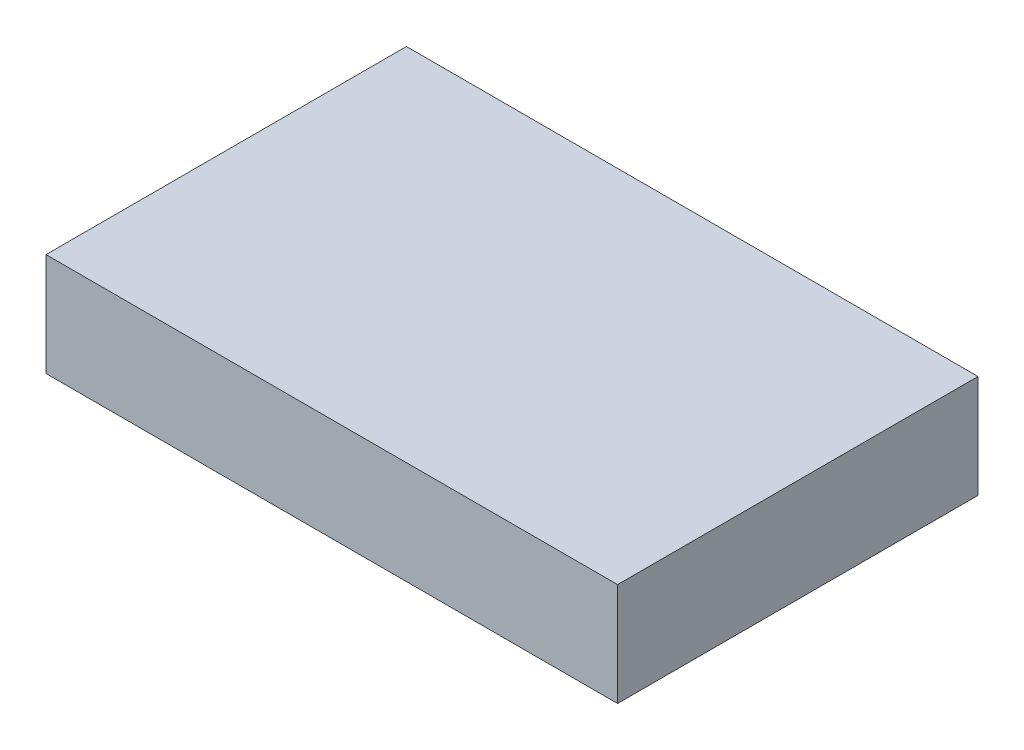
ISO-10303-21;
HEADER;
FILE_DESCRIPTION(('STEP AP214'),'2;1');
FILE_NAME('part.step','',(''),(''),'','','');
FILE_SCHEMA(('AUTOMOTIVE_DESIGN { 1 0 10303 214 1 1 1 1 }'));
ENDSEC;
DATA;
#1=APPLICATION_CONTEXT('core data for automotive mechanical design processes');
#2=APPLICATION_PROTOCOL_DEFINITION('international standard','automotive_design',2000,#1);
#3=PRODUCT_CONTEXT('',#1,'mechanical');
#4=PRODUCT('Part','Part','',(#3));
#5=PRODUCT_RELATED_PRODUCT_CATEGORY('part','',(#4));
#6=PRODUCT_DEFINITION_FORMATION('','',#4);
#7=PRODUCT_DEFINITION_CONTEXT('part definition',#1,'design');
#8=PRODUCT_DEFINITION('design','',#6,#7);
#9=PRODUCT_DEFINITION_SHAPE('','',#8);
#10=(LENGTH_UNIT() NAMED_UNIT(*) SI_UNIT(.MILLI.,.METRE.));
#11=(NAMED_UNIT(*) PLANE_ANGLE_UNIT() SI_UNIT($,.RADIAN.));
#12=(NAMED_UNIT(*) SI_UNIT($,.STERADIAN.) SOLID_ANGLE_UNIT());
#13=UNCERTAINTY_MEASURE_WITH_UNIT(LENGTH_MEASURE(1.E-05),#10,'distance_accuracy_value','');
#14=(GEOMETRIC_REPRESENTATION_CONTEXT(3) GLOBAL_UNCERTAINTY_ASSIGNED_CONTEXT((#13)) GLOBAL_UNIT_ASSIGNED_CONTEXT((#10,
#11,#12)) REPRESENTATION_CONTEXT('',''));
#15=CARTESIAN_POINT('',(0.,0.,0.));
#16=DIRECTION('',(0.,0.,1.));
#17=DIRECTION('',(1.,0.,0.));
#18=AXIS2_PLACEMENT_3D('',#15,#16,#17);
#19=CARTESIAN_POINT('',(0.,20.,0.));
#20=DIRECTION('',(1.,0.,0.));
#21=DIRECTION('',(0.,0.,-1.));
#22=AXIS2_PLACEMENT_3D('',#19,#20,#21);
#23=PLANE('',#22);
#24=DIRECTION('',(0.,0.,1.));
#25=VECTOR('',#24,1.);
#26=CARTESIAN_POINT('',(0.,0.,0.));
#27=LINE('',#26,#25);
#28=CARTESIAN_POINT('',(0.,0.,0.));
#29=VERTEX_POINT('',#28);
#30=CARTESIAN_POINT('',(0.,0.,70.));
#31=VERTEX_POINT('',#30);
#32=EDGE_CURVE('E97',#29,#31,#27,.T.);
#33=ORIENTED_EDGE('',*,*,#32,.T.);
#34=DIRECTION('',(0.,-1.,0.));
#35=VECTOR('',#34,1.);
#36=CARTESIAN_POINT('',(0.,20.,70.));
#37=LINE('',#36,#35);
#38=CARTESIAN_POINT('',(0.,20.,70.));
#39=VERTEX_POINT('',#38);
#40=EDGE_CURVE('E11',#39,#31,#37,.T.);
#41=ORIENTED_EDGE('',*,*,#40,.F.);
#42=DIRECTION('',(0.,0.,1.));
#43=VECTOR('',#42,1.);
#44=CARTESIAN_POINT('',(0.,20.,0.));
#45=LINE('',#44,#43);
#46=CARTESIAN_POINT('',(0.,20.,0.));
#47=VERTEX_POINT('',#46);
#48=EDGE_CURVE('E85',#47,#39,#45,.T.);
#49=ORIENTED_EDGE('',*,*,#48,.F.);
#50=DIRECTION('',(0.,-1.,0.));
#51=VECTOR('',#50,1.);
#52=CARTESIAN_POINT('',(0.,20.,0.));
#53=LINE('',#52,#51);
#54=EDGE_CURVE('E93',#47,#29,#53,.T.);
#55=ORIENTED_EDGE('',*,*,#54,.T.);
#56=EDGE_LOOP('',(#33,#41,#49,#55));
#57=FACE_BOUND('',#56,.T.);
#58=ADVANCED_FACE('F34',(#57),#23,.F.);
#59=CARTESIAN_POINT('',(0.,20.,70.));
#60=DIRECTION('',(0.,0.,-1.));
#61=DIRECTION('',(-1.,0.,0.));
#62=AXIS2_PLACEMENT_3D('',#59,#60,#61);
#63=PLANE('',#62);
#64=DIRECTION('',(1.,0.,0.));
#65=VECTOR('',#64,1.);
#66=CARTESIAN_POINT('',(0.,0.,70.));
#67=LINE('',#66,#65);
#68=CARTESIAN_POINT('',(111.,0.,70.));
#69=VERTEX_POINT('',#68);
#70=EDGE_CURVE('E89',#31,#69,#67,.T.);
#71=ORIENTED_EDGE('',*,*,#70,.T.);
#72=DIRECTION('',(0.,-1.,0.));
#73=VECTOR('',#72,1.);
#74=CARTESIAN_POINT('',(111.,20.,70.));
#75=LINE('',#74,#73);
#76=CARTESIAN_POINT('',(111.,20.,70.));
#77=VERTEX_POINT('',#76);
#78=EDGE_CURVE('E42',#77,#69,#75,.T.);
#79=ORIENTED_EDGE('',*,*,#78,.F.);
#80=DIRECTION('',(1.,0.,0.));
#81=VECTOR('',#80,1.);
#82=CARTESIAN_POINT('',(0.,20.,70.));
#83=LINE('',#82,#81);
#84=EDGE_CURVE('E80',#39,#77,#83,.T.);
#85=ORIENTED_EDGE('',*,*,#84,.F.);
#86=ORIENTED_EDGE('',*,*,#40,.T.);
#87=EDGE_LOOP('',(#71,#79,#85,#86));
#88=FACE_BOUND('',#87,.T.);
#89=ADVANCED_FACE('F88',(#88),#63,.F.);
#90=CARTESIAN_POINT('',(111.,20.,0.));
#91=DIRECTION('',(-1.,0.,0.));
#92=DIRECTION('',(0.,0.,1.));
#93=AXIS2_PLACEMENT_3D('',#90,#91,#92);
#94=PLANE('',#93);
#95=DIRECTION('',(0.,0.,-1.));
#96=VECTOR('',#95,1.);
#97=CARTESIAN_POINT('',(111.,0.,0.));
#98=LINE('',#97,#96);
#99=CARTESIAN_POINT('',(111.,0.,0.));
#100=VERTEX_POINT('',#99);
#101=EDGE_CURVE('E67',#69,#100,#98,.T.);
#102=ORIENTED_EDGE('',*,*,#101,.T.);
#103=DIRECTION('',(0.,-1.,0.));
#104=VECTOR('',#103,1.);
#105=CARTESIAN_POINT('',(111.,20.,0.));
#106=LINE('',#105,#104);
#107=CARTESIAN_POINT('',(111.,20.,0.));
#108=VERTEX_POINT('',#107);
#109=EDGE_CURVE('E90',#108,#100,#106,.T.);
#110=ORIENTED_EDGE('',*,*,#109,.F.);
#111=DIRECTION('',(0.,0.,-1.));
#112=VECTOR('',#111,1.);
#113=CARTESIAN_POINT('',(111.,20.,0.));
#114=LINE('',#113,#112);
#115=EDGE_CURVE('E83',#77,#108,#114,.T.);
#116=ORIENTED_EDGE('',*,*,#115,.F.);
#117=ORIENTED_EDGE('',*,*,#78,.T.);
#118=EDGE_LOOP('',(#102,#110,#116,#117));
#119=FACE_BOUND('',#118,.T.);
#120=ADVANCED_FACE('F91',(#119),#94,.F.);
#121=CARTESIAN_POINT('',(0.,20.,0.));
#122=DIRECTION('',(0.,0.,1.));
#123=DIRECTION('',(1.,0.,0.));
#124=AXIS2_PLACEMENT_3D('',#121,#122,#123);
#125=PLANE('',#124);
#126=DIRECTION('',(-1.,0.,0.));
#127=VECTOR('',#126,1.);
#128=CARTESIAN_POINT('',(0.,0.,0.));
#129=LINE('',#128,#127);
#130=EDGE_CURVE('E73',#100,#29,#129,.T.);
#131=ORIENTED_EDGE('',*,*,#130,.T.);
#132=ORIENTED_EDGE('',*,*,#54,.F.);
#133=DIRECTION('',(-1.,0.,0.));
#134=VECTOR('',#133,1.);
#135=CARTESIAN_POINT('',(0.,20.,0.));
#136=LINE('',#135,#134);
#137=EDGE_CURVE('E50',#108,#47,#136,.T.);
#138=ORIENTED_EDGE('',*,*,#137,.F.);
#139=ORIENTED_EDGE('',*,*,#109,.T.);
#140=EDGE_LOOP('',(#131,#132,#138,#139));
#141=FACE_BOUND('',#140,.T.);
#142=ADVANCED_FACE('F104',(#141),#125,.F.);
#143=CARTESIAN_POINT('',(0.,20.,0.));
#144=DIRECTION('',(0.,1.,0.));
#145=DIRECTION('',(0.,0.,1.));
#146=AXIS2_PLACEMENT_3D('',#143,#144,#145);
#147=PLANE('',#146);
#148=ORIENTED_EDGE('',*,*,#48,.T.);
#149=ORIENTED_EDGE('',*,*,#84,.T.);
#150=ORIENTED_EDGE('',*,*,#115,.T.);
#151=ORIENTED_EDGE('',*,*,#137,.T.);
#152=EDGE_LOOP('',(#148,#149,#150,#151));
#153=FACE_BOUND('',#152,.T.);
#154=ADVANCED_FACE('F81',(#153),#147,.T.);
#155=CARTESIAN_POINT('',(0.,0.,0.));
#156=DIRECTION('',(0.,1.,0.));
#157=DIRECTION('',(0.,0.,1.));
#158=AXIS2_PLACEMENT_3D('',#155,#156,#157);
#159=PLANE('',#158);
#160=ORIENTED_EDGE('',*,*,#32,.F.);
#161=ORIENTED_EDGE('',*,*,#130,.F.);
#162=ORIENTED_EDGE('',*,*,#101,.F.);
#163=ORIENTED_EDGE('',*,*,#70,.F.);
#164=EDGE_LOOP('',(#160,#161,#162,#163));
#165=FACE_BOUND('',#164,.T.);
#166=ADVANCED_FACE('F107',(#165),#159,.F.);
#167=CLOSED_SHELL('',(#58,#89,#120,#142,#154,#166));
#168=MANIFOLD_SOLID_BREP('B2',#167);
#169=ADVANCED_BREP_SHAPE_REPRESENTATION('',(#18,#168),#14);
#170=SHAPE_DEFINITION_REPRESENTATION(#9,#169);
ENDSEC;
END-ISO-10303-21;
